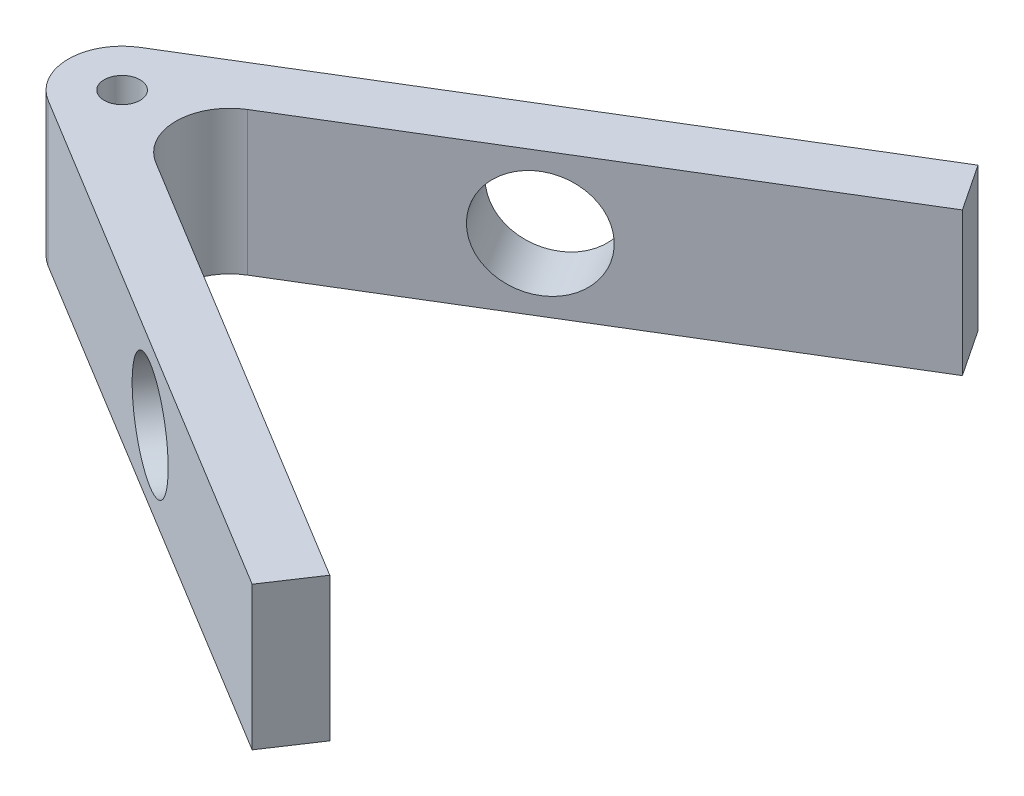
ISO-10303-21;
HEADER;
FILE_DESCRIPTION(('STEP AP214'),'2;1');
FILE_NAME('part.step','',(''),(''),'','','');
FILE_SCHEMA(('AUTOMOTIVE_DESIGN { 1 0 10303 214 1 1 1 1 }'));
ENDSEC;
DATA;
#1=APPLICATION_CONTEXT('core data for automotive mechanical design processes');
#2=APPLICATION_PROTOCOL_DEFINITION('international standard','automotive_design',2000,#1);
#3=PRODUCT_CONTEXT('',#1,'mechanical');
#4=PRODUCT('Part','Part','',(#3));
#5=PRODUCT_RELATED_PRODUCT_CATEGORY('part','',(#4));
#6=PRODUCT_DEFINITION_FORMATION('','',#4);
#7=PRODUCT_DEFINITION_CONTEXT('part definition',#1,'design');
#8=PRODUCT_DEFINITION('design','',#6,#7);
#9=PRODUCT_DEFINITION_SHAPE('','',#8);
#10=(LENGTH_UNIT() NAMED_UNIT(*) SI_UNIT(.MILLI.,.METRE.));
#11=(NAMED_UNIT(*) PLANE_ANGLE_UNIT() SI_UNIT($,.RADIAN.));
#12=(NAMED_UNIT(*) SI_UNIT($,.STERADIAN.) SOLID_ANGLE_UNIT());
#13=UNCERTAINTY_MEASURE_WITH_UNIT(LENGTH_MEASURE(1.E-05),#10,'distance_accuracy_value','');
#14=(GEOMETRIC_REPRESENTATION_CONTEXT(3) GLOBAL_UNCERTAINTY_ASSIGNED_CONTEXT((#13)) GLOBAL_UNIT_ASSIGNED_CONTEXT((#10,
#11,#12)) REPRESENTATION_CONTEXT('',''));
#15=CARTESIAN_POINT('',(0.,0.,0.));
#16=DIRECTION('',(0.,0.,1.));
#17=DIRECTION('',(1.,0.,0.));
#18=AXIS2_PLACEMENT_3D('',#15,#16,#17);
#19=CARTESIAN_POINT('',(-29.531337363767,40.,0.));
#20=DIRECTION('',(0.,1.,0.));
#21=DIRECTION('',(0.,0.,1.));
#22=AXIS2_PLACEMENT_3D('',#19,#20,#21);
#23=PLANE('',#22);
#24=CARTESIAN_POINT('',(-29.531337363767,40.,0.));
#25=DIRECTION('',(0.,1.,0.));
#26=DIRECTION('',(0.,0.,1.));
#27=AXIS2_PLACEMENT_3D('',#24,#25,#26);
#28=CIRCLE('',#27,15.);
#29=CARTESIAN_POINT('',(-37.3280107747878,40.,-12.8145184740544));
#30=VERTEX_POINT('',#29);
#31=CARTESIAN_POINT('',(-37.3280107747878,40.,12.8145184740544));
#32=VERTEX_POINT('',#31);
#33=EDGE_CURVE('E165',#30,#32,#28,.T.);
#34=ORIENTED_EDGE('',*,*,#33,.T.);
#35=DIRECTION('',(0.854301231603626,0.,0.519778227401386));
#36=VECTOR('',#35,1.);
#37=CARTESIAN_POINT('',(-37.3280107747878,40.,12.8145184740544));
#38=LINE('',#37,#36);
#39=CARTESIAN_POINT('',(107.903198597829,40.,101.17681713229));
#40=VERTEX_POINT('',#39);
#41=EDGE_CURVE('E101',#32,#40,#38,.T.);
#42=ORIENTED_EDGE('',*,*,#41,.T.);
#43=DIRECTION('',(0.553790397725764,0.,-0.832656108718803));
#44=VECTOR('',#43,1.);
#45=CARTESIAN_POINT('',(116.545667807738,40.,88.1823614472554));
#46=LINE('',#45,#44);
#47=CARTESIAN_POINT('',(116.545667807738,40.,88.1823614472554));
#48=VERTEX_POINT('',#47);
#49=EDGE_CURVE('E187',#40,#48,#46,.T.);
#50=ORIENTED_EDGE('',*,*,#49,.T.);
#51=DIRECTION('',(-0.854301231603626,0.,-0.519778227401387));
#52=VECTOR('',#51,1.);
#53=CARTESIAN_POINT('',(-7.32801077478784,40.,12.8145184740544));
#54=LINE('',#53,#52);
#55=CARTESIAN_POINT('',(-7.32801077478784,40.,12.8145184740544));
#56=VERTEX_POINT('',#55);
#57=EDGE_CURVE('E201',#48,#56,#54,.T.);
#58=ORIENTED_EDGE('',*,*,#57,.T.);
#59=CARTESIAN_POINT('',(0.468662636232957,40.,0.));
#60=DIRECTION('',(0.,-1.,0.));
#61=DIRECTION('',(0.,0.,1.));
#62=AXIS2_PLACEMENT_3D('',#59,#60,#61);
#63=CIRCLE('',#62,15.);
#64=CARTESIAN_POINT('',(-7.32801077478784,40.,-12.8145184740544));
#65=VERTEX_POINT('',#64);
#66=EDGE_CURVE('E120',#56,#65,#63,.T.);
#67=ORIENTED_EDGE('',*,*,#66,.T.);
#68=DIRECTION('',(0.854301231603626,0.,-0.519778227401387));
#69=VECTOR('',#68,1.);
#70=CARTESIAN_POINT('',(-7.32801077478784,40.,-12.8145184740544));
#71=LINE('',#70,#69);
#72=CARTESIAN_POINT('',(116.545667807738,40.,-88.1823614472554));
#73=VERTEX_POINT('',#72);
#74=EDGE_CURVE('E114',#65,#73,#71,.T.);
#75=ORIENTED_EDGE('',*,*,#74,.T.);
#76=DIRECTION('',(-0.553790397725764,0.,-0.832656108718803));
#77=VECTOR('',#76,1.);
#78=CARTESIAN_POINT('',(116.545667807738,40.,-88.1823614472554));
#79=LINE('',#78,#77);
#80=CARTESIAN_POINT('',(107.903198597829,40.,-101.17681713229));
#81=VERTEX_POINT('',#80);
#82=EDGE_CURVE('E118',#73,#81,#79,.T.);
#83=ORIENTED_EDGE('',*,*,#82,.T.);
#84=DIRECTION('',(-0.854301231603626,0.,0.519778227401386));
#85=VECTOR('',#84,1.);
#86=CARTESIAN_POINT('',(-37.3280107747878,40.,-12.8145184740544));
#87=LINE('',#86,#85);
#88=EDGE_CURVE('E58',#81,#30,#87,.T.);
#89=ORIENTED_EDGE('',*,*,#88,.T.);
#90=EDGE_LOOP('',(#34,#42,#50,#58,#67,#75,#83,#89));
#91=FACE_BOUND('',#90,.T.);
#92=CARTESIAN_POINT('',(-29.531337363767,40.,0.));
#93=DIRECTION('',(0.,1.,0.));
#94=DIRECTION('',(0.,0.,1.));
#95=AXIS2_PLACEMENT_3D('',#92,#93,#94);
#96=CIRCLE('',#95,5.);
#97=CARTESIAN_POINT('',(-29.531337363767,40.,5.));
#98=VERTEX_POINT('',#97);
#99=EDGE_CURVE('E147',#98,#98,#96,.T.);
#100=ORIENTED_EDGE('',*,*,#99,.F.);
#101=EDGE_LOOP('',(#100));
#102=FACE_BOUND('',#101,.T.);
#103=ADVANCED_FACE('F39',(#91,#102),#23,.T.);
#104=CARTESIAN_POINT('',(-29.531337363767,0.,0.));
#105=DIRECTION('',(0.,1.,0.));
#106=DIRECTION('',(0.,0.,1.));
#107=AXIS2_PLACEMENT_3D('',#104,#105,#106);
#108=PLANE('',#107);
#109=CARTESIAN_POINT('',(-29.531337363767,0.,0.));
#110=DIRECTION('',(0.,1.,0.));
#111=DIRECTION('',(0.,0.,1.));
#112=AXIS2_PLACEMENT_3D('',#109,#110,#111);
#113=CIRCLE('',#112,15.);
#114=CARTESIAN_POINT('',(-37.3280107747878,0.,-12.8145184740544));
#115=VERTEX_POINT('',#114);
#116=CARTESIAN_POINT('',(-37.3280107747878,0.,12.8145184740544));
#117=VERTEX_POINT('',#116);
#118=EDGE_CURVE('E142',#115,#117,#113,.T.);
#119=ORIENTED_EDGE('',*,*,#118,.F.);
#120=DIRECTION('',(-0.854301231603626,0.,0.519778227401386));
#121=VECTOR('',#120,1.);
#122=CARTESIAN_POINT('',(-37.3280107747878,0.,-12.8145184740544));
#123=LINE('',#122,#121);
#124=CARTESIAN_POINT('',(107.903198597829,0.,-101.17681713229));
#125=VERTEX_POINT('',#124);
#126=EDGE_CURVE('E93',#125,#115,#123,.T.);
#127=ORIENTED_EDGE('',*,*,#126,.F.);
#128=DIRECTION('',(-0.553790397725764,0.,-0.832656108718803));
#129=VECTOR('',#128,1.);
#130=CARTESIAN_POINT('',(116.545667807738,0.,-88.1823614472554));
#131=LINE('',#130,#129);
#132=CARTESIAN_POINT('',(116.545667807738,0.,-88.1823614472554));
#133=VERTEX_POINT('',#132);
#134=EDGE_CURVE('E87',#133,#125,#131,.T.);
#135=ORIENTED_EDGE('',*,*,#134,.F.);
#136=DIRECTION('',(0.854301231603626,0.,-0.519778227401387));
#137=VECTOR('',#136,1.);
#138=CARTESIAN_POINT('',(-7.32801077478784,0.,-12.8145184740544));
#139=LINE('',#138,#137);
#140=CARTESIAN_POINT('',(-7.32801077478784,0.,-12.8145184740544));
#141=VERTEX_POINT('',#140);
#142=EDGE_CURVE('E129',#141,#133,#139,.T.);
#143=ORIENTED_EDGE('',*,*,#142,.F.);
#144=CARTESIAN_POINT('',(0.468662636232957,0.,0.));
#145=DIRECTION('',(0.,-1.,0.));
#146=DIRECTION('',(0.,0.,1.));
#147=AXIS2_PLACEMENT_3D('',#144,#145,#146);
#148=CIRCLE('',#147,15.);
#149=CARTESIAN_POINT('',(-7.32801077478784,0.,12.8145184740544));
#150=VERTEX_POINT('',#149);
#151=EDGE_CURVE('E156',#150,#141,#148,.T.);
#152=ORIENTED_EDGE('',*,*,#151,.F.);
#153=DIRECTION('',(-0.854301231603626,0.,-0.519778227401387));
#154=VECTOR('',#153,1.);
#155=CARTESIAN_POINT('',(-7.32801077478784,0.,12.8145184740544));
#156=LINE('',#155,#154);
#157=CARTESIAN_POINT('',(116.545667807738,0.,88.1823614472554));
#158=VERTEX_POINT('',#157);
#159=EDGE_CURVE('E153',#158,#150,#156,.T.);
#160=ORIENTED_EDGE('',*,*,#159,.F.);
#161=DIRECTION('',(0.553790397725764,0.,-0.832656108718803));
#162=VECTOR('',#161,1.);
#163=CARTESIAN_POINT('',(116.545667807738,0.,88.1823614472554));
#164=LINE('',#163,#162);
#165=CARTESIAN_POINT('',(107.903198597829,0.,101.17681713229));
#166=VERTEX_POINT('',#165);
#167=EDGE_CURVE('E150',#166,#158,#164,.T.);
#168=ORIENTED_EDGE('',*,*,#167,.F.);
#169=DIRECTION('',(0.854301231603626,0.,0.519778227401386));
#170=VECTOR('',#169,1.);
#171=CARTESIAN_POINT('',(-37.3280107747878,0.,12.8145184740544));
#172=LINE('',#171,#170);
#173=EDGE_CURVE('E146',#117,#166,#172,.T.);
#174=ORIENTED_EDGE('',*,*,#173,.F.);
#175=EDGE_LOOP('',(#119,#127,#135,#143,#152,#160,#168,#174));
#176=FACE_BOUND('',#175,.T.);
#177=CARTESIAN_POINT('',(-29.531337363767,0.,0.));
#178=DIRECTION('',(0.,1.,0.));
#179=DIRECTION('',(0.,0.,1.));
#180=AXIS2_PLACEMENT_3D('',#177,#178,#179);
#181=CIRCLE('',#180,5.);
#182=CARTESIAN_POINT('',(-29.531337363767,0.,5.));
#183=VERTEX_POINT('',#182);
#184=EDGE_CURVE('E211',#183,#183,#181,.T.);
#185=ORIENTED_EDGE('',*,*,#184,.T.);
#186=EDGE_LOOP('',(#185));
#187=FACE_BOUND('',#186,.T.);
#188=ADVANCED_FACE('F191',(#176,#187),#108,.F.);
#189=CARTESIAN_POINT('',(-29.531337363767,40.,0.));
#190=DIRECTION('',(0.,-1.,0.));
#191=DIRECTION('',(0.,0.,-1.));
#192=AXIS2_PLACEMENT_3D('',#189,#190,#191);
#193=CYLINDRICAL_SURFACE('',#192,15.);
#194=ORIENTED_EDGE('',*,*,#118,.T.);
#195=DIRECTION('',(0.,-1.,0.));
#196=VECTOR('',#195,1.);
#197=CARTESIAN_POINT('',(-37.3280107747878,40.,12.8145184740544));
#198=LINE('',#197,#196);
#199=EDGE_CURVE('E11',#32,#117,#198,.T.);
#200=ORIENTED_EDGE('',*,*,#199,.F.);
#201=ORIENTED_EDGE('',*,*,#33,.F.);
#202=DIRECTION('',(0.,-1.,0.));
#203=VECTOR('',#202,1.);
#204=CARTESIAN_POINT('',(-37.3280107747878,40.,-12.8145184740544));
#205=LINE('',#204,#203);
#206=EDGE_CURVE('E138',#30,#115,#205,.T.);
#207=ORIENTED_EDGE('',*,*,#206,.T.);
#208=EDGE_LOOP('',(#194,#200,#201,#207));
#209=FACE_BOUND('',#208,.T.);
#210=ADVANCED_FACE('F41',(#209),#193,.T.);
#211=CARTESIAN_POINT('',(-37.3280107747878,40.,12.8145184740544));
#212=DIRECTION('',(0.519778227401386,0.,-0.854301231603626));
#213=DIRECTION('',(-0.854301231603626,0.,-0.519778227401386));
#214=AXIS2_PLACEMENT_3D('',#211,#212,#213);
#215=PLANE('',#214);
#216=CARTESIAN_POINT('',(35.2875939115204,20.,56.9956678031723));
#217=DIRECTION('',(-0.519778227401387,0.,0.854301231603626));
#218=DIRECTION('',(0.854301231603626,0.,0.519778227401387));
#219=AXIS2_PLACEMENT_3D('',#216,#217,#218);
#220=CIRCLE('',#219,15.);
#221=CARTESIAN_POINT('',(48.1021123855748,20.,64.7923412141931));
#222=VERTEX_POINT('',#221);
#223=EDGE_CURVE('E218',#222,#222,#220,.T.);
#224=ORIENTED_EDGE('',*,*,#223,.F.);
#225=EDGE_LOOP('',(#224));
#226=FACE_BOUND('',#225,.T.);
#227=ORIENTED_EDGE('',*,*,#173,.T.);
#228=DIRECTION('',(0.,-1.,0.));
#229=VECTOR('',#228,1.);
#230=CARTESIAN_POINT('',(107.903198597829,40.,101.17681713229));
#231=LINE('',#230,#229);
#232=EDGE_CURVE('E50',#40,#166,#231,.T.);
#233=ORIENTED_EDGE('',*,*,#232,.F.);
#234=ORIENTED_EDGE('',*,*,#41,.F.);
#235=ORIENTED_EDGE('',*,*,#199,.T.);
#236=EDGE_LOOP('',(#227,#233,#234,#235));
#237=FACE_BOUND('',#236,.T.);
#238=ADVANCED_FACE('F279',(#226,#237),#215,.F.);
#239=CARTESIAN_POINT('',(116.545667807738,40.,88.1823614472554));
#240=DIRECTION('',(-0.832656108718803,0.,-0.553790397725764));
#241=DIRECTION('',(-0.553790397725764,0.,0.832656108718803));
#242=AXIS2_PLACEMENT_3D('',#239,#240,#241);
#243=PLANE('',#242);
#244=ORIENTED_EDGE('',*,*,#167,.T.);
#245=DIRECTION('',(0.,-1.,0.));
#246=VECTOR('',#245,1.);
#247=CARTESIAN_POINT('',(116.545667807738,40.,88.1823614472554));
#248=LINE('',#247,#246);
#249=EDGE_CURVE('E176',#48,#158,#248,.T.);
#250=ORIENTED_EDGE('',*,*,#249,.F.);
#251=ORIENTED_EDGE('',*,*,#49,.F.);
#252=ORIENTED_EDGE('',*,*,#232,.T.);
#253=EDGE_LOOP('',(#244,#250,#251,#252));
#254=FACE_BOUND('',#253,.T.);
#255=ADVANCED_FACE('F185',(#254),#243,.F.);
#256=CARTESIAN_POINT('',(-7.32801077478784,40.,12.8145184740544));
#257=DIRECTION('',(-0.519778227401387,0.,0.854301231603626));
#258=DIRECTION('',(0.854301231603626,0.,0.519778227401387));
#259=AXIS2_PLACEMENT_3D('',#256,#257,#258);
#260=PLANE('',#259);
#261=CARTESIAN_POINT('',(43.3926760819362,20.,43.6742524082796));
#262=DIRECTION('',(-0.519778227401387,0.,0.854301231603626));
#263=DIRECTION('',(0.854301231603626,0.,0.519778227401387));
#264=AXIS2_PLACEMENT_3D('',#261,#262,#263);
#265=CIRCLE('',#264,15.);
#266=CARTESIAN_POINT('',(56.2071945559906,20.,51.4709258193004));
#267=VERTEX_POINT('',#266);
#268=EDGE_CURVE('E43',#267,#267,#265,.T.);
#269=ORIENTED_EDGE('',*,*,#268,.T.);
#270=EDGE_LOOP('',(#269));
#271=FACE_BOUND('',#270,.T.);
#272=ORIENTED_EDGE('',*,*,#159,.T.);
#273=DIRECTION('',(0.,-1.,0.));
#274=VECTOR('',#273,1.);
#275=CARTESIAN_POINT('',(-7.32801077478784,40.,12.8145184740544));
#276=LINE('',#275,#274);
#277=EDGE_CURVE('E172',#56,#150,#276,.T.);
#278=ORIENTED_EDGE('',*,*,#277,.F.);
#279=ORIENTED_EDGE('',*,*,#57,.F.);
#280=ORIENTED_EDGE('',*,*,#249,.T.);
#281=EDGE_LOOP('',(#272,#278,#279,#280));
#282=FACE_BOUND('',#281,.T.);
#283=ADVANCED_FACE('F196',(#271,#282),#260,.F.);
#284=CARTESIAN_POINT('',(0.468662636232957,40.,0.));
#285=DIRECTION('',(0.,-1.,0.));
#286=DIRECTION('',(0.,0.,-1.));
#287=AXIS2_PLACEMENT_3D('',#284,#285,#286);
#288=CYLINDRICAL_SURFACE('',#287,15.);
#289=ORIENTED_EDGE('',*,*,#151,.T.);
#290=DIRECTION('',(0.,-1.,0.));
#291=VECTOR('',#290,1.);
#292=CARTESIAN_POINT('',(-7.32801077478784,40.,-12.8145184740544));
#293=LINE('',#292,#291);
#294=EDGE_CURVE('E131',#65,#141,#293,.T.);
#295=ORIENTED_EDGE('',*,*,#294,.F.);
#296=ORIENTED_EDGE('',*,*,#66,.F.);
#297=ORIENTED_EDGE('',*,*,#277,.T.);
#298=EDGE_LOOP('',(#289,#295,#296,#297));
#299=FACE_BOUND('',#298,.T.);
#300=ADVANCED_FACE('F199',(#299),#288,.F.);
#301=CARTESIAN_POINT('',(-7.32801077478784,40.,-12.8145184740544));
#302=DIRECTION('',(-0.519778227401387,0.,-0.854301231603626));
#303=DIRECTION('',(-0.854301231603626,0.,0.519778227401387));
#304=AXIS2_PLACEMENT_3D('',#301,#302,#303);
#305=PLANE('',#304);
#306=CARTESIAN_POINT('',(43.3926760819362,20.,-43.6742524082796));
#307=DIRECTION('',(-0.519778227401387,0.,-0.854301231603626));
#308=DIRECTION('',(-0.854301231603626,0.,0.519778227401387));
#309=AXIS2_PLACEMENT_3D('',#306,#307,#308);
#310=CIRCLE('',#309,15.);
#311=CARTESIAN_POINT('',(30.5781576078818,20.,-35.8775789972588));
#312=VERTEX_POINT('',#311);
#313=EDGE_CURVE('E222',#312,#312,#310,.T.);
#314=ORIENTED_EDGE('',*,*,#313,.T.);
#315=EDGE_LOOP('',(#314));
#316=FACE_BOUND('',#315,.T.);
#317=ORIENTED_EDGE('',*,*,#142,.T.);
#318=DIRECTION('',(0.,-1.,0.));
#319=VECTOR('',#318,1.);
#320=CARTESIAN_POINT('',(116.545667807738,40.,-88.1823614472554));
#321=LINE('',#320,#319);
#322=EDGE_CURVE('E126',#73,#133,#321,.T.);
#323=ORIENTED_EDGE('',*,*,#322,.F.);
#324=ORIENTED_EDGE('',*,*,#74,.F.);
#325=ORIENTED_EDGE('',*,*,#294,.T.);
#326=EDGE_LOOP('',(#317,#323,#324,#325));
#327=FACE_BOUND('',#326,.T.);
#328=ADVANCED_FACE('F127',(#316,#327),#305,.F.);
#329=CARTESIAN_POINT('',(116.545667807738,40.,-88.1823614472554));
#330=DIRECTION('',(-0.832656108718803,0.,0.553790397725764));
#331=DIRECTION('',(0.553790397725764,0.,0.832656108718803));
#332=AXIS2_PLACEMENT_3D('',#329,#330,#331);
#333=PLANE('',#332);
#334=ORIENTED_EDGE('',*,*,#134,.T.);
#335=DIRECTION('',(0.,-1.,0.));
#336=VECTOR('',#335,1.);
#337=CARTESIAN_POINT('',(107.903198597829,40.,-101.17681713229));
#338=LINE('',#337,#336);
#339=EDGE_CURVE('E132',#81,#125,#338,.T.);
#340=ORIENTED_EDGE('',*,*,#339,.F.);
#341=ORIENTED_EDGE('',*,*,#82,.F.);
#342=ORIENTED_EDGE('',*,*,#322,.T.);
#343=EDGE_LOOP('',(#334,#340,#341,#342));
#344=FACE_BOUND('',#343,.T.);
#345=ADVANCED_FACE('F134',(#344),#333,.F.);
#346=CARTESIAN_POINT('',(-37.3280107747878,40.,-12.8145184740544));
#347=DIRECTION('',(0.519778227401386,0.,0.854301231603626));
#348=DIRECTION('',(0.854301231603626,0.,-0.519778227401386));
#349=AXIS2_PLACEMENT_3D('',#346,#347,#348);
#350=PLANE('',#349);
#351=CARTESIAN_POINT('',(35.2875939115204,20.,-56.9956678031723));
#352=DIRECTION('',(-0.519778227401387,0.,-0.854301231603626));
#353=DIRECTION('',(-0.854301231603626,0.,0.519778227401387));
#354=AXIS2_PLACEMENT_3D('',#351,#352,#353);
#355=CIRCLE('',#354,15.);
#356=CARTESIAN_POINT('',(22.473075437466,20.,-49.1989943921515));
#357=VERTEX_POINT('',#356);
#358=EDGE_CURVE('E226',#357,#357,#355,.T.);
#359=ORIENTED_EDGE('',*,*,#358,.F.);
#360=EDGE_LOOP('',(#359));
#361=FACE_BOUND('',#360,.T.);
#362=ORIENTED_EDGE('',*,*,#126,.T.);
#363=ORIENTED_EDGE('',*,*,#206,.F.);
#364=ORIENTED_EDGE('',*,*,#88,.F.);
#365=ORIENTED_EDGE('',*,*,#339,.T.);
#366=EDGE_LOOP('',(#362,#363,#364,#365));
#367=FACE_BOUND('',#366,.T.);
#368=ADVANCED_FACE('F234',(#361,#367),#350,.F.);
#369=CARTESIAN_POINT('',(-29.531337363767,40.,0.));
#370=DIRECTION('',(0.,-1.,0.));
#371=DIRECTION('',(0.,0.,-1.));
#372=AXIS2_PLACEMENT_3D('',#369,#370,#371);
#373=CYLINDRICAL_SURFACE('',#372,5.);
#374=ORIENTED_EDGE('',*,*,#99,.T.);
#375=EDGE_LOOP('',(#374));
#376=FACE_BOUND('',#375,.T.);
#377=ORIENTED_EDGE('',*,*,#184,.F.);
#378=EDGE_LOOP('',(#377));
#379=FACE_BOUND('',#378,.T.);
#380=ADVANCED_FACE('F236',(#376,#379),#373,.F.);
#381=CARTESIAN_POINT('',(56.0787230075759,20.,22.8236185390272));
#382=DIRECTION('',(-0.519778227401387,0.,0.854301231603626));
#383=DIRECTION('',(0.854301231603626,0.,0.519778227401387));
#384=AXIS2_PLACEMENT_3D('',#381,#382,#383);
#385=CYLINDRICAL_SURFACE('',#384,15.);
#386=ORIENTED_EDGE('',*,*,#223,.T.);
#387=EDGE_LOOP('',(#386));
#388=FACE_BOUND('',#387,.T.);
#389=ORIENTED_EDGE('',*,*,#268,.F.);
#390=EDGE_LOOP('',(#389));
#391=FACE_BOUND('',#390,.T.);
#392=ADVANCED_FACE('F242',(#388,#391),#385,.F.);
#393=CARTESIAN_POINT('',(56.0787230075758,20.,-22.8236185390272));
#394=DIRECTION('',(-0.519778227401387,0.,-0.854301231603626));
#395=DIRECTION('',(-0.854301231603626,0.,0.519778227401387));
#396=AXIS2_PLACEMENT_3D('',#393,#394,#395);
#397=CYLINDRICAL_SURFACE('',#396,15.);
#398=ORIENTED_EDGE('',*,*,#358,.T.);
#399=EDGE_LOOP('',(#398));
#400=FACE_BOUND('',#399,.T.);
#401=ORIENTED_EDGE('',*,*,#313,.F.);
#402=EDGE_LOOP('',(#401));
#403=FACE_BOUND('',#402,.T.);
#404=ADVANCED_FACE('F231',(#400,#403),#397,.F.);
#405=CLOSED_SHELL('',(#103,#188,#210,#238,#255,#283,#300,#328,#345,#368,#380,#392,#404));
#406=MANIFOLD_SOLID_BREP('B2',#405);
#407=ADVANCED_BREP_SHAPE_REPRESENTATION('',(#18,#406),#14);
#408=SHAPE_DEFINITION_REPRESENTATION(#9,#407);
ENDSEC;
END-ISO-10303-21;
